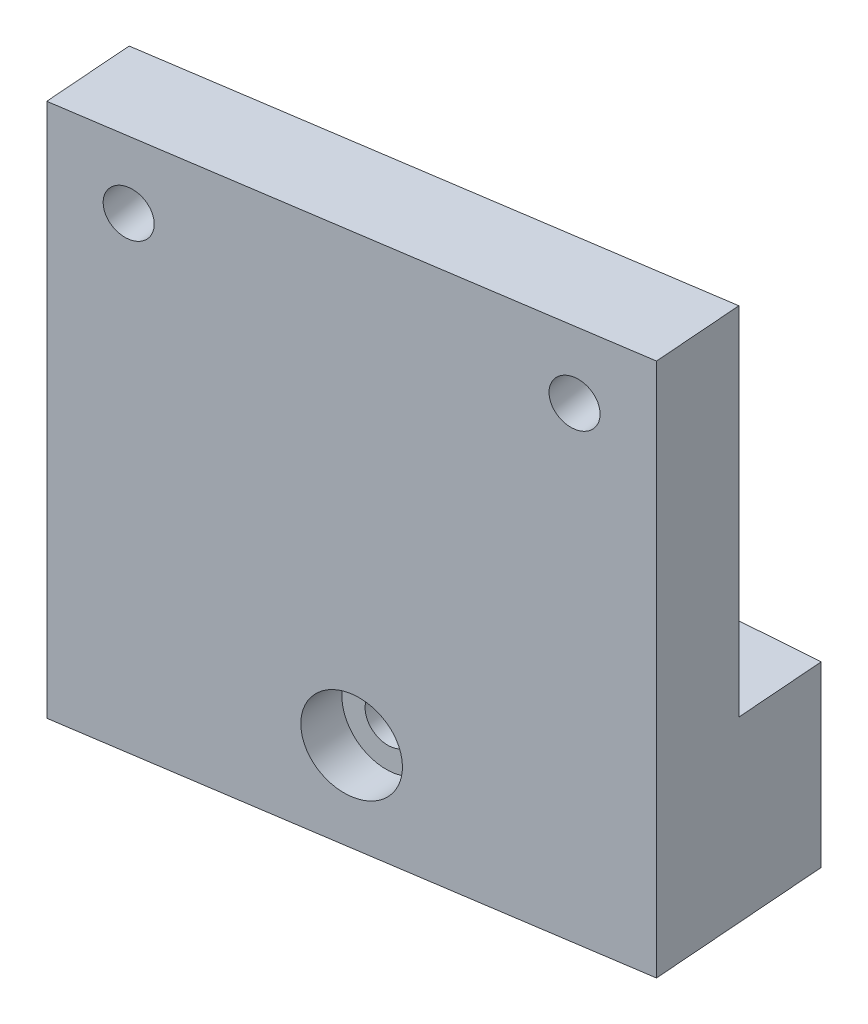
ISO-10303-21;
HEADER;
FILE_DESCRIPTION(('STEP AP214'),'2;1');
FILE_NAME('part.step','',(''),(''),'','','');
FILE_SCHEMA(('AUTOMOTIVE_DESIGN { 1 0 10303 214 1 1 1 1 }'));
ENDSEC;
DATA;
#1=APPLICATION_CONTEXT('core data for automotive mechanical design processes');
#2=APPLICATION_PROTOCOL_DEFINITION('international standard','automotive_design',2000,#1);
#3=PRODUCT_CONTEXT('',#1,'mechanical');
#4=PRODUCT('Part','Part','',(#3));
#5=PRODUCT_RELATED_PRODUCT_CATEGORY('part','',(#4));
#6=PRODUCT_DEFINITION_FORMATION('','',#4);
#7=PRODUCT_DEFINITION_CONTEXT('part definition',#1,'design');
#8=PRODUCT_DEFINITION('design','',#6,#7);
#9=PRODUCT_DEFINITION_SHAPE('','',#8);
#10=(LENGTH_UNIT() NAMED_UNIT(*) SI_UNIT(.MILLI.,.METRE.));
#11=(NAMED_UNIT(*) PLANE_ANGLE_UNIT() SI_UNIT($,.RADIAN.));
#12=(NAMED_UNIT(*) SI_UNIT($,.STERADIAN.) SOLID_ANGLE_UNIT());
#13=UNCERTAINTY_MEASURE_WITH_UNIT(LENGTH_MEASURE(1.E-05),#10,'distance_accuracy_value','');
#14=(GEOMETRIC_REPRESENTATION_CONTEXT(3) GLOBAL_UNCERTAINTY_ASSIGNED_CONTEXT((#13)) GLOBAL_UNIT_ASSIGNED_CONTEXT((#10,
#11,#12)) REPRESENTATION_CONTEXT('',''));
#15=CARTESIAN_POINT('',(0.,0.,0.));
#16=DIRECTION('',(0.,0.,1.));
#17=DIRECTION('',(1.,0.,0.));
#18=AXIS2_PLACEMENT_3D('',#15,#16,#17);
#19=CARTESIAN_POINT('',(201.637084779475,-2.09319908891186E-12,317.83234828125));
#20=DIRECTION('',(0.149160969546302,0.,0.988812927284027));
#21=DIRECTION('',(-0.988812927284027,0.,0.149160969546302));
#22=AXIS2_PLACEMENT_3D('',#19,#20,#21);
#23=PLANE('',#22);
#24=DIRECTION('',(0.988812927284027,0.,-0.149160969546302));
#25=VECTOR('',#24,1.);
#26=CARTESIAN_POINT('',(170.785083125901,-25.4000000000014,322.486327160482));
#27=LINE('',#26,#25);
#28=CARTESIAN_POINT('',(101.38564669068,-25.4,332.955129639711));
#29=VERTEX_POINT('',#28);
#30=CARTESIAN_POINT('',(176.944809549979,-25.4000000000016,321.557141527685));
#31=VERTEX_POINT('',#30);
#32=EDGE_CURVE('E111',#29,#31,#27,.T.);
#33=ORIENTED_EDGE('',*,*,#32,.T.);
#34=DIRECTION('',(0.,-1.,0.));
#35=VECTOR('',#34,1.);
#36=CARTESIAN_POINT('',(176.944809549979,-1.51692598349367E-12,321.557141527685));
#37=LINE('',#36,#35);
#38=CARTESIAN_POINT('',(176.94480954998,50.7999999999984,321.557141527685));
#39=VERTEX_POINT('',#38);
#40=EDGE_CURVE('E150',#39,#31,#37,.T.);
#41=ORIENTED_EDGE('',*,*,#40,.F.);
#42=DIRECTION('',(-0.988812927284027,0.,0.149160969546302));
#43=VECTOR('',#42,1.);
#44=CARTESIAN_POINT('',(101.385646690681,50.8,332.95512963971));
#45=LINE('',#44,#43);
#46=CARTESIAN_POINT('',(101.385646690681,50.8,332.95512963971));
#47=VERTEX_POINT('',#46);
#48=EDGE_CURVE('E171',#39,#47,#45,.T.);
#49=ORIENTED_EDGE('',*,*,#48,.T.);
#50=DIRECTION('',(0.,1.,0.));
#51=VECTOR('',#50,1.);
#52=CARTESIAN_POINT('',(101.38564669068,-7.223339336555E-13,332.955129639711));
#53=LINE('',#52,#51);
#54=EDGE_CURVE('E147',#29,#47,#53,.T.);
#55=ORIENTED_EDGE('',*,*,#54,.F.);
#56=EDGE_LOOP('',(#33,#41,#49,#55));
#57=FACE_BOUND('',#56,.T.);
#58=CARTESIAN_POINT('',(111.537794932015,41.2749999999998,331.423693072822));
#59=DIRECTION('',(-0.149160969546302,0.,-0.988812927284027));
#60=DIRECTION('',(-0.988812927284027,0.,0.149160969546302));
#61=AXIS2_PLACEMENT_3D('',#58,#59,#60);
#62=CIRCLE('',#61,3.1999999500002);
#63=CARTESIAN_POINT('',(108.373593614146,41.2749999999999,331.901008167912));
#64=VERTEX_POINT('',#63);
#65=EDGE_CURVE('E179',#64,#64,#62,.T.);
#66=ORIENTED_EDGE('',*,*,#65,.T.);
#67=EDGE_LOOP('',(#66));
#68=FACE_BOUND('',#67,.T.);
#69=CARTESIAN_POINT('',(166.792661308646,41.2749999999986,323.088578094574));
#70=DIRECTION('',(-0.149160969546302,0.,-0.988812927284027));
#71=DIRECTION('',(-0.988812927284027,0.,0.149160969546302));
#72=AXIS2_PLACEMENT_3D('',#69,#70,#71);
#73=CIRCLE('',#72,3.19999995000018);
#74=CARTESIAN_POINT('',(163.628459990778,41.2749999999987,323.565893189664));
#75=VERTEX_POINT('',#74);
#76=EDGE_CURVE('E123',#75,#75,#73,.T.);
#77=ORIENTED_EDGE('',*,*,#76,.T.);
#78=EDGE_LOOP('',(#77));
#79=FACE_BOUND('',#78,.T.);
#80=DIRECTION('',(0.,-1.,0.));
#81=VECTOR('',#80,1.);
#82=CARTESIAN_POINT('',(132.886266032077,-6.51266168130561E-13,328.203307740317));
#83=LINE('',#82,#81);
#84=CARTESIAN_POINT('',(132.886266032077,-12.2268346567056,328.203307740317));
#85=VERTEX_POINT('',#84);
#86=CARTESIAN_POINT('',(132.886266032077,-13.1766669993989,328.203307740317));
#87=VERTEX_POINT('',#86);
#88=EDGE_CURVE('E54',#85,#87,#83,.T.);
#89=ORIENTED_EDGE('',*,*,#88,.F.);
#90=CARTESIAN_POINT('',(139.165228120329,-12.7017508280524,327.256135583698));
#91=DIRECTION('',(-0.149160969546302,0.,-0.988812927284027));
#92=DIRECTION('',(-0.988812927284027,0.,0.149160969546302));
#93=AXIS2_PLACEMENT_3D('',#90,#91,#92);
#94=ELLIPSE('',#93,6.36783433064178,6.35);
#95=EDGE_CURVE('E12',#87,#85,#94,.F.);
#96=ORIENTED_EDGE('',*,*,#95,.F.);
#97=EDGE_LOOP('',(#89,#96));
#98=FACE_BOUND('',#97,.T.);
#99=ADVANCED_FACE('F45',(#57,#68,#79,#98),#23,.T.);
#100=CARTESIAN_POINT('',(183.174224896517,-1.58880373895447E-12,404.616012814854));
#101=DIRECTION('',(0.,-1.,0.));
#102=DIRECTION('',(-0.149160969546302,0.,-0.988812927284027));
#103=AXIS2_PLACEMENT_3D('',#100,#101,#102);
#104=PLANE('',#103);
#105=DIRECTION('',(0.988812927284027,0.,-0.149160969546302));
#106=VECTOR('',#105,1.);
#107=CARTESIAN_POINT('',(175.992309549979,-1.5781280467579E-12,308.857141527685));
#108=LINE('',#107,#106);
#109=CARTESIAN_POINT('',(100.43314669068,0.,320.255129639711));
#110=VERTEX_POINT('',#109);
#111=CARTESIAN_POINT('',(175.992309549979,-1.5781280467579E-12,308.857141527685));
#112=VERTEX_POINT('',#111);
#113=EDGE_CURVE('E120',#110,#112,#108,.T.);
#114=ORIENTED_EDGE('',*,*,#113,.T.);
#115=DIRECTION('',(-0.0747899482416343,0.,-0.997199309888456));
#116=VECTOR('',#115,1.);
#117=CARTESIAN_POINT('',(183.174224896517,-1.58853268489992E-12,404.616012814854));
#118=LINE('',#117,#116);
#119=CARTESIAN_POINT('',(175.039809549979,-1.58836636081722E-12,296.157141527685));
#120=VERTEX_POINT('',#119);
#121=EDGE_CURVE('E126',#112,#120,#118,.T.);
#122=ORIENTED_EDGE('',*,*,#121,.T.);
#123=DIRECTION('',(0.997199309888457,0.,-0.0747899482416342));
#124=VECTOR('',#123,1.);
#125=CARTESIAN_POINT('',(175.03980954998,-1.58863741487177E-12,296.157141527685));
#126=LINE('',#125,#124);
#127=CARTESIAN_POINT('',(99.0532221364789,0.,301.856135583698));
#128=VERTEX_POINT('',#127);
#129=EDGE_CURVE('E139',#128,#120,#126,.T.);
#130=ORIENTED_EDGE('',*,*,#129,.F.);
#131=DIRECTION('',(-0.0747899482416343,0.,-0.997199309888456));
#132=VECTOR('',#131,1.);
#133=CARTESIAN_POINT('',(107.187637483017,0.,410.315006870867));
#134=LINE('',#133,#132);
#135=EDGE_CURVE('E114',#110,#128,#134,.T.);
#136=ORIENTED_EDGE('',*,*,#135,.F.);
#137=EDGE_LOOP('',(#114,#122,#130,#136));
#138=FACE_BOUND('',#137,.T.);
#139=ADVANCED_FACE('F204',(#138),#104,.F.);
#140=CARTESIAN_POINT('',(145.180931189767,-12.7017508280524,407.465509842861));
#141=DIRECTION('',(-0.0747899482416343,0.,-0.997199309888456));
#142=DIRECTION('',(0.997199309888457,0.,-0.0747899482416342));
#143=AXIS2_PLACEMENT_3D('',#140,#141,#142);
#144=CYLINDRICAL_SURFACE('',#143,3.26390000000057);
#145=CARTESIAN_POINT('',(138.725830904868,-12.7017508280524,321.397506044216));
#146=DIRECTION('',(0.0747899482416342,0.,0.997199309888456));
#147=DIRECTION('',(0.997199309888456,0.,-0.0747899482416342));
#148=AXIS2_PLACEMENT_3D('',#145,#146,#147);
#149=CIRCLE('',#148,3.26390000000057);
#150=CARTESIAN_POINT('',(141.980589732414,-12.7017508280524,321.15339913215));
#151=VERTEX_POINT('',#150);
#152=EDGE_CURVE('E49',#151,#151,#149,.T.);
#153=CARTESIAN_POINT('',(137.046515843229,-12.7017508280524,299.006638555692));
#154=DIRECTION('',(-0.0747899482416343,0.,-0.997199309888456));
#155=DIRECTION('',(-0.997199309888456,0.,0.0747899482416342));
#156=AXIS2_PLACEMENT_3D('',#153,#154,#155);
#157=CIRCLE('',#156,3.26390000000057);
#158=CARTESIAN_POINT('',(140.301274670774,-12.7017508280524,298.762531643626));
#159=VERTEX_POINT('',#158);
#160=EDGE_CURVE('E144',#159,#159,#157,.T.);
#161=CARTESIAN_POINT('',(141.980589732414,-12.7017508280524,321.15339913215));
#162=CARTESIAN_POINT('',(141.963096867188,-12.7017508280524,320.920160929144));
#163=CARTESIAN_POINT('',(141.945604001963,-12.7017508280524,320.686922726139));
#164=CARTESIAN_POINT('',(141.910618271512,-12.7017508280524,320.220446320128));
#165=CARTESIAN_POINT('',(141.893125406287,-12.7017508280524,319.987208117123));
#166=CARTESIAN_POINT('',(141.858139675836,-12.7017508280524,319.520731711112));
#167=CARTESIAN_POINT('',(141.84064681061,-12.7017508280524,319.287493508106));
#168=CARTESIAN_POINT('',(141.80566108016,-12.7017508280524,318.821017102095));
#169=CARTESIAN_POINT('',(141.788168214934,-12.7017508280524,318.58777889909));
#170=CARTESIAN_POINT('',(141.753182484483,-12.7017508280524,318.121302493079));
#171=CARTESIAN_POINT('',(141.735689619258,-12.7017508280524,317.888064290073));
#172=CARTESIAN_POINT('',(141.700703888807,-12.7017508280524,317.421587884062));
#173=CARTESIAN_POINT('',(141.683211023582,-12.7017508280524,317.188349681057));
#174=CARTESIAN_POINT('',(141.648225293131,-12.7017508280524,316.721873275046));
#175=CARTESIAN_POINT('',(141.630732427905,-12.7017508280524,316.488635072041));
#176=CARTESIAN_POINT('',(141.595746697455,-12.7017508280524,316.02215866603));
#177=CARTESIAN_POINT('',(141.578253832229,-12.7017508280524,315.788920463024));
#178=CARTESIAN_POINT('',(141.543268101778,-12.7017508280524,315.322444057013));
#179=CARTESIAN_POINT('',(141.525775236553,-12.7017508280524,315.089205854008));
#180=CARTESIAN_POINT('',(141.490789506102,-12.7017508280524,314.622729447997));
#181=CARTESIAN_POINT('',(141.473296640877,-12.7017508280524,314.389491244992));
#182=CARTESIAN_POINT('',(141.438310910426,-12.7017508280524,313.923014838981));
#183=CARTESIAN_POINT('',(141.420818045201,-12.7017508280524,313.689776635975));
#184=CARTESIAN_POINT('',(141.38583231475,-12.7017508280524,313.223300229964));
#185=CARTESIAN_POINT('',(141.368339449524,-12.7017508280524,312.990062026959));
#186=CARTESIAN_POINT('',(141.333353719074,-12.7017508280524,312.523585620948));
#187=CARTESIAN_POINT('',(141.315860853848,-12.7017508280524,312.290347417942));
#188=CARTESIAN_POINT('',(141.280875123397,-12.7017508280524,311.823871011931));
#189=CARTESIAN_POINT('',(141.263382258172,-12.7017508280524,311.590632808926));
#190=CARTESIAN_POINT('',(141.228396527721,-12.7017508280524,311.124156402915));
#191=CARTESIAN_POINT('',(141.210903662496,-12.7017508280524,310.89091819991));
#192=CARTESIAN_POINT('',(141.175917932045,-12.7017508280524,310.424441793899));
#193=CARTESIAN_POINT('',(141.158425066819,-12.7017508280524,310.191203590893));
#194=CARTESIAN_POINT('',(141.123439336369,-12.7017508280524,309.724727184882));
#195=CARTESIAN_POINT('',(141.105946471143,-12.7017508280524,309.491488981877));
#196=CARTESIAN_POINT('',(141.070960740692,-12.7017508280524,309.025012575866));
#197=CARTESIAN_POINT('',(141.053467875467,-12.7017508280524,308.791774372861));
#198=CARTESIAN_POINT('',(141.018482145016,-12.7017508280524,308.32529796685));
#199=CARTESIAN_POINT('',(141.000989279791,-12.7017508280524,308.092059763844));
#200=CARTESIAN_POINT('',(140.96600354934,-12.7017508280524,307.625583357833));
#201=CARTESIAN_POINT('',(140.948510684115,-12.7017508280524,307.392345154828));
#202=CARTESIAN_POINT('',(140.913524953664,-12.7017508280524,306.925868748817));
#203=CARTESIAN_POINT('',(140.896032088438,-12.7017508280524,306.692630545811));
#204=CARTESIAN_POINT('',(140.861046357988,-12.7017508280524,306.2261541398));
#205=CARTESIAN_POINT('',(140.843553492762,-12.7017508280524,305.992915936795));
#206=CARTESIAN_POINT('',(140.808567762311,-12.7017508280524,305.526439530784));
#207=CARTESIAN_POINT('',(140.791074897086,-12.7017508280524,305.293201327779));
#208=CARTESIAN_POINT('',(140.756089166635,-12.7017508280524,304.826724921768));
#209=CARTESIAN_POINT('',(140.73859630141,-12.7017508280524,304.593486718762));
#210=CARTESIAN_POINT('',(140.703610570959,-12.7017508280524,304.127010312751));
#211=CARTESIAN_POINT('',(140.686117705733,-12.7017508280524,303.893772109746));
#212=CARTESIAN_POINT('',(140.651131975283,-12.7017508280524,303.427295703735));
#213=CARTESIAN_POINT('',(140.633639110057,-12.7017508280524,303.194057500729));
#214=CARTESIAN_POINT('',(140.598653379606,-12.7017508280524,302.727581094719));
#215=CARTESIAN_POINT('',(140.581160514381,-12.7017508280524,302.494342891713));
#216=CARTESIAN_POINT('',(140.54617478393,-12.7017508280524,302.027866485702));
#217=CARTESIAN_POINT('',(140.528681918705,-12.7017508280524,301.794628282697));
#218=CARTESIAN_POINT('',(140.493696188254,-12.7017508280524,301.328151876686));
#219=CARTESIAN_POINT('',(140.476203323028,-12.7017508280524,301.09491367368));
#220=CARTESIAN_POINT('',(140.441217592578,-12.7017508280524,300.628437267669));
#221=CARTESIAN_POINT('',(140.423724727352,-12.7017508280524,300.395199064664));
#222=CARTESIAN_POINT('',(140.388738996901,-12.7017508280524,299.928722658653));
#223=CARTESIAN_POINT('',(140.371246131676,-12.7017508280524,299.695484455648));
#224=CARTESIAN_POINT('',(140.336260401225,-12.7017508280524,299.229008049637));
#225=CARTESIAN_POINT('',(140.318767536,-12.7017508280524,298.995769846631));
#226=CARTESIAN_POINT('',(140.301274670774,-12.7017508280524,298.762531643626));
#227=B_SPLINE_CURVE_WITH_KNOTS('',3,(#161,#162,#163,#164,#165,#166,#167,#168,#169,#170,#171,
#172,#173,#174,#175,#176,#177,#178,#179,#180,#181,#182,#183,#184,#185,#186,#187,#188,#189,#190,
#191,#192,#193,#194,#195,#196,#197,#198,#199,#200,#201,#202,#203,#204,#205,#206,#207,#208,#209,
#210,#211,#212,#213,#214,#215,#216,#217,#218,#219,#220,#221,#222,#223,#224,#225,#226),
.UNSPECIFIED.,.F.,.F.,(4,2,2,2,2,2,2,2,2,2,2,2,2,2,2,2,2,2,2,2,2,2,2,2,2,2,2,2,2,2,2,2,4),(0.,
0.701679796684399,1.40335959336885,2.10503939005325,2.80671918673765,3.50839898342211,
4.21007878010656,4.91175857679096,5.61343837347536,6.31511817015982,7.01679796684421,
7.71847776352861,8.42015756021307,9.12183735689752,9.82351715358192,10.5251969502663,
11.2268767469508,11.9285565436352,12.6302363403196,13.331916137004,14.0335959336885,
14.7352757303729,15.4369555270573,16.1386353237417,16.8403151204261,17.5419949171106,
18.243674713795,18.9453545104794,19.6470343071638,20.3487141038482,21.0503939005327,
21.7520736972171,22.4537534939016),.UNSPECIFIED.);
#228=EDGE_CURVE('BSEAM47',#151,#159,#227,.T.);
#229=ORIENTED_EDGE('',*,*,#152,.T.);
#230=ORIENTED_EDGE('',*,*,#160,.T.);
#231=ORIENTED_EDGE('',*,*,#228,.T.);
#232=ORIENTED_EDGE('',*,*,#228,.F.);
#233=EDGE_LOOP('',(#229,#231,#230,#232));
#234=FACE_BOUND('',#233,.T.);
#235=ADVANCED_FACE('F47',(#234),#144,.F.);
#236=CARTESIAN_POINT('',(175.03980954998,-1.57121667002262E-12,296.157141527685));
#237=DIRECTION('',(0.0747899482416343,0.,0.997199309888456));
#238=DIRECTION('',(-0.997199309888456,0.,0.0747899482416342));
#239=AXIS2_PLACEMENT_3D('',#236,#237,#238);
#240=PLANE('',#239);
#241=CARTESIAN_POINT('',(156.043162696604,-12.7017508280528,297.581890041689));
#242=DIRECTION('',(-0.0747899482416343,0.,-0.997199309888456));
#243=DIRECTION('',(-0.997199309888456,0.,0.0747899482416342));
#244=AXIS2_PLACEMENT_3D('',#241,#242,#243);
#245=CIRCLE('',#244,2.3622000000004);
#246=CARTESIAN_POINT('',(153.687578486785,-12.7017508280527,297.758558857425));
#247=VERTEX_POINT('',#246);
#248=EDGE_CURVE('E160',#247,#247,#245,.T.);
#249=ORIENTED_EDGE('',*,*,#248,.F.);
#250=EDGE_LOOP('',(#249));
#251=FACE_BOUND('',#250,.T.);
#252=CARTESIAN_POINT('',(118.049868989854,-12.701750828052,300.431387069695));
#253=DIRECTION('',(-0.0747899482416343,0.,-0.997199309888456));
#254=DIRECTION('',(-0.997199309888456,0.,0.0747899482416342));
#255=AXIS2_PLACEMENT_3D('',#252,#253,#254);
#256=CIRCLE('',#255,2.36220000000041);
#257=CARTESIAN_POINT('',(115.694284780035,-12.7017508280519,300.608055885431));
#258=VERTEX_POINT('',#257);
#259=EDGE_CURVE('E154',#258,#258,#256,.T.);
#260=ORIENTED_EDGE('',*,*,#259,.F.);
#261=EDGE_LOOP('',(#260));
#262=FACE_BOUND('',#261,.T.);
#263=ORIENTED_EDGE('',*,*,#160,.F.);
#264=EDGE_LOOP('',(#263));
#265=FACE_BOUND('',#264,.T.);
#266=DIRECTION('',(0.,1.,0.));
#267=VECTOR('',#266,1.);
#268=CARTESIAN_POINT('',(99.0532221364789,-7.82398205812949E-13,301.856135583698));
#269=LINE('',#268,#267);
#270=CARTESIAN_POINT('',(99.0532221364787,-25.4,301.856135583698));
#271=VERTEX_POINT('',#270);
#272=EDGE_CURVE('E142',#271,#128,#269,.T.);
#273=ORIENTED_EDGE('',*,*,#272,.T.);
#274=ORIENTED_EDGE('',*,*,#129,.T.);
#275=DIRECTION('',(0.,-1.,0.));
#276=VECTOR('',#275,1.);
#277=CARTESIAN_POINT('',(175.039809549979,-1.57121667002262E-12,296.157141527685));
#278=LINE('',#277,#276);
#279=CARTESIAN_POINT('',(175.039809549979,-25.4000000000016,296.157141527685));
#280=VERTEX_POINT('',#279);
#281=EDGE_CURVE('E136',#120,#280,#278,.T.);
#282=ORIENTED_EDGE('',*,*,#281,.T.);
#283=DIRECTION('',(0.997199309888456,0.,-0.0747899482416342));
#284=VECTOR('',#283,1.);
#285=CARTESIAN_POINT('',(175.039809549979,-25.4000000000016,296.157141527685));
#286=LINE('',#285,#284);
#287=EDGE_CURVE('E133',#271,#280,#286,.T.);
#288=ORIENTED_EDGE('',*,*,#287,.F.);
#289=EDGE_LOOP('',(#273,#274,#282,#288));
#290=FACE_BOUND('',#289,.T.);
#291=ADVANCED_FACE('F217',(#251,#262,#265,#290),#240,.F.);
#292=CARTESIAN_POINT('',(183.174224896517,-25.4000000000016,404.616012814854));
#293=DIRECTION('',(0.,-1.,0.));
#294=DIRECTION('',(-0.988812927284027,0.,0.149160969546302));
#295=AXIS2_PLACEMENT_3D('',#292,#293,#294);
#296=PLANE('',#295);
#297=DIRECTION('',(-0.0747899482416343,0.,-0.997199309888456));
#298=VECTOR('',#297,1.);
#299=CARTESIAN_POINT('',(107.187637483016,-25.4,410.315006870867));
#300=LINE('',#299,#298);
#301=EDGE_CURVE('E131',#29,#271,#300,.T.);
#302=ORIENTED_EDGE('',*,*,#301,.T.);
#303=ORIENTED_EDGE('',*,*,#287,.T.);
#304=DIRECTION('',(-0.0747899482416343,0.,-0.997199309888456));
#305=VECTOR('',#304,1.);
#306=CARTESIAN_POINT('',(183.174224896517,-25.4000000000016,404.616012814854));
#307=LINE('',#306,#305);
#308=EDGE_CURVE('E129',#31,#280,#307,.T.);
#309=ORIENTED_EDGE('',*,*,#308,.F.);
#310=ORIENTED_EDGE('',*,*,#32,.F.);
#311=EDGE_LOOP('',(#302,#303,#309,#310));
#312=FACE_BOUND('',#311,.T.);
#313=ADVANCED_FACE('F220',(#312),#296,.T.);
#314=CARTESIAN_POINT('',(183.174224896517,-1.57138299410532E-12,404.616012814854));
#315=DIRECTION('',(-0.997199309888456,0.,0.0747899482416342));
#316=DIRECTION('',(-0.0747899482416343,0.,-0.997199309888457));
#317=AXIS2_PLACEMENT_3D('',#314,#315,#316);
#318=PLANE('',#317);
#319=ORIENTED_EDGE('',*,*,#40,.T.);
#320=ORIENTED_EDGE('',*,*,#308,.T.);
#321=ORIENTED_EDGE('',*,*,#281,.F.);
#322=ORIENTED_EDGE('',*,*,#121,.F.);
#323=DIRECTION('',(0.,-1.,0.));
#324=VECTOR('',#323,1.);
#325=CARTESIAN_POINT('',(175.99230954998,50.7999999999984,308.857141527685));
#326=LINE('',#325,#324);
#327=CARTESIAN_POINT('',(175.99230954998,50.7999999999984,308.857141527685));
#328=VERTEX_POINT('',#327);
#329=EDGE_CURVE('E166',#328,#112,#326,.T.);
#330=ORIENTED_EDGE('',*,*,#329,.F.);
#331=DIRECTION('',(0.0747899482416343,0.,0.997199309888456));
#332=VECTOR('',#331,1.);
#333=CARTESIAN_POINT('',(176.94480954998,50.7999999999984,321.557141527685));
#334=LINE('',#333,#332);
#335=EDGE_CURVE('E168',#328,#39,#334,.T.);
#336=ORIENTED_EDGE('',*,*,#335,.T.);
#337=EDGE_LOOP('',(#319,#320,#321,#322,#330,#336));
#338=FACE_BOUND('',#337,.T.);
#339=ADVANCED_FACE('F224',(#338),#318,.F.);
#340=CARTESIAN_POINT('',(107.187637483017,-7.82564529895654E-13,410.315006870867));
#341=DIRECTION('',(0.997199309888456,0.,-0.0747899482416342));
#342=DIRECTION('',(0.0747899482416343,0.,0.997199309888457));
#343=AXIS2_PLACEMENT_3D('',#340,#341,#342);
#344=PLANE('',#343);
#345=ORIENTED_EDGE('',*,*,#54,.T.);
#346=DIRECTION('',(-0.0747899482416346,0.,-0.997199309888456));
#347=VECTOR('',#346,1.);
#348=CARTESIAN_POINT('',(100.433146690681,50.8,320.255129639711));
#349=LINE('',#348,#347);
#350=CARTESIAN_POINT('',(100.433146690681,50.8,320.255129639711));
#351=VERTEX_POINT('',#350);
#352=EDGE_CURVE('E175',#47,#351,#349,.T.);
#353=ORIENTED_EDGE('',*,*,#352,.T.);
#354=DIRECTION('',(0.,-1.,0.));
#355=VECTOR('',#354,1.);
#356=CARTESIAN_POINT('',(100.433146690681,50.8,320.255129639711));
#357=LINE('',#356,#355);
#358=EDGE_CURVE('E67',#351,#110,#357,.T.);
#359=ORIENTED_EDGE('',*,*,#358,.T.);
#360=ORIENTED_EDGE('',*,*,#135,.T.);
#361=ORIENTED_EDGE('',*,*,#272,.F.);
#362=ORIENTED_EDGE('',*,*,#301,.F.);
#363=EDGE_LOOP('',(#345,#353,#359,#360,#361,#362));
#364=FACE_BOUND('',#363,.T.);
#365=ADVANCED_FACE('F227',(#364),#344,.F.);
#366=CARTESIAN_POINT('',(117.574952818519,-12.701750828052,294.099171451903));
#367=DIRECTION('',(0.0747899482416343,0.,0.997199309888456));
#368=DIRECTION('',(-0.997199309888457,0.,0.0747899482416342));
#369=AXIS2_PLACEMENT_3D('',#366,#367,#368);
#370=CYLINDRICAL_SURFACE('',#369,2.36220000000041);
#371=CARTESIAN_POINT('',(117.574952818519,-12.701750828052,294.099171451903));
#372=DIRECTION('',(-0.0747899482416343,0.,-0.997199309888456));
#373=DIRECTION('',(-0.997199309888456,0.,0.0747899482416342));
#374=AXIS2_PLACEMENT_3D('',#371,#372,#373);
#375=CIRCLE('',#374,2.36220000000041);
#376=CARTESIAN_POINT('',(115.2193686087,-12.7017508280519,294.27584026764));
#377=VERTEX_POINT('',#376);
#378=EDGE_CURVE('E157',#377,#377,#375,.T.);
#379=CARTESIAN_POINT('',(115.2193686087,-12.7017508280519,294.27584026764));
#380=CARTESIAN_POINT('',(115.224315652152,-12.7017508280519,294.341800846992));
#381=CARTESIAN_POINT('',(115.229262695603,-12.7017508280519,294.407761426344));
#382=CARTESIAN_POINT('',(115.239156782506,-12.7017508280519,294.539682585048));
#383=CARTESIAN_POINT('',(115.244103825957,-12.7017508280519,294.6056431644));
#384=CARTESIAN_POINT('',(115.25399791286,-12.7017508280519,294.737564323104));
#385=CARTESIAN_POINT('',(115.258944956312,-12.7017508280519,294.803524902456));
#386=CARTESIAN_POINT('',(115.268839043214,-12.7017508280519,294.935446061159));
#387=CARTESIAN_POINT('',(115.273786086666,-12.7017508280519,295.001406640512));
#388=CARTESIAN_POINT('',(115.283680173569,-12.7017508280519,295.133327799216));
#389=CARTESIAN_POINT('',(115.28862721702,-12.7017508280519,295.199288378568));
#390=CARTESIAN_POINT('',(115.298521303923,-12.7017508280519,295.331209537271));
#391=CARTESIAN_POINT('',(115.303468347374,-12.7017508280519,295.397170116624));
#392=CARTESIAN_POINT('',(115.313362434277,-12.7017508280519,295.529091275328));
#393=CARTESIAN_POINT('',(115.318309477728,-12.7017508280519,295.595051854679));
#394=CARTESIAN_POINT('',(115.328203564631,-12.7017508280519,295.726973013383));
#395=CARTESIAN_POINT('',(115.333150608083,-12.7017508280519,295.792933592735));
#396=CARTESIAN_POINT('',(115.343044694985,-12.7017508280519,295.924854751439));
#397=CARTESIAN_POINT('',(115.347991738437,-12.7017508280519,295.990815330791));
#398=CARTESIAN_POINT('',(115.35788582534,-12.7017508280519,296.122736489495));
#399=CARTESIAN_POINT('',(115.362832868791,-12.7017508280519,296.188697068847));
#400=CARTESIAN_POINT('',(115.372726955694,-12.7017508280519,296.320618227551));
#401=CARTESIAN_POINT('',(115.377673999145,-12.7017508280519,296.386578806903));
#402=CARTESIAN_POINT('',(115.387568086048,-12.7017508280519,296.518499965607));
#403=CARTESIAN_POINT('',(115.392515129499,-12.7017508280519,296.584460544959));
#404=CARTESIAN_POINT('',(115.402409216402,-12.7017508280519,296.716381703663));
#405=CARTESIAN_POINT('',(115.407356259854,-12.7017508280519,296.782342283015));
#406=CARTESIAN_POINT('',(115.417250346756,-12.7017508280519,296.914263441719));
#407=CARTESIAN_POINT('',(115.422197390208,-12.7017508280519,296.980224021071));
#408=CARTESIAN_POINT('',(115.432091477111,-12.7017508280519,297.112145179775));
#409=CARTESIAN_POINT('',(115.437038520562,-12.7017508280519,297.178105759127));
#410=CARTESIAN_POINT('',(115.446932607465,-12.7017508280519,297.310026917831));
#411=CARTESIAN_POINT('',(115.451879650916,-12.7017508280519,297.375987497183));
#412=CARTESIAN_POINT('',(115.461773737819,-12.7017508280519,297.507908655887));
#413=CARTESIAN_POINT('',(115.46672078127,-12.7017508280519,297.573869235239));
#414=CARTESIAN_POINT('',(115.476614868173,-12.7017508280519,297.705790393943));
#415=CARTESIAN_POINT('',(115.481561911625,-12.7017508280519,297.771750973295));
#416=CARTESIAN_POINT('',(115.491455998527,-12.7017508280519,297.903672131999));
#417=CARTESIAN_POINT('',(115.496403041979,-12.7017508280519,297.969632711351));
#418=CARTESIAN_POINT('',(115.506297128882,-12.7017508280519,298.101553870055));
#419=CARTESIAN_POINT('',(115.511244172333,-12.7017508280519,298.167514449407));
#420=CARTESIAN_POINT('',(115.521138259236,-12.7017508280519,298.299435608111));
#421=CARTESIAN_POINT('',(115.526085302687,-12.7017508280519,298.365396187463));
#422=CARTESIAN_POINT('',(115.53597938959,-12.7017508280519,298.497317346167));
#423=CARTESIAN_POINT('',(115.540926433041,-12.7017508280519,298.563277925519));
#424=CARTESIAN_POINT('',(115.550820519944,-12.7017508280519,298.695199084223));
#425=CARTESIAN_POINT('',(115.555767563396,-12.7017508280519,298.761159663575));
#426=CARTESIAN_POINT('',(115.565661650298,-12.7017508280519,298.893080822279));
#427=CARTESIAN_POINT('',(115.57060869375,-12.7017508280519,298.959041401631));
#428=CARTESIAN_POINT('',(115.580502780653,-12.7017508280519,299.090962560335));
#429=CARTESIAN_POINT('',(115.585449824104,-12.7017508280519,299.156923139687));
#430=CARTESIAN_POINT('',(115.595343911007,-12.7017508280519,299.288844298391));
#431=CARTESIAN_POINT('',(115.600290954458,-12.7017508280519,299.354804877743));
#432=CARTESIAN_POINT('',(115.610185041361,-12.7017508280519,299.486726036447));
#433=CARTESIAN_POINT('',(115.615132084812,-12.7017508280519,299.552686615799));
#434=CARTESIAN_POINT('',(115.625026171715,-12.7017508280519,299.684607774503));
#435=CARTESIAN_POINT('',(115.629973215167,-12.7017508280519,299.750568353855));
#436=CARTESIAN_POINT('',(115.639867302069,-12.7017508280519,299.882489512559));
#437=CARTESIAN_POINT('',(115.644814345521,-12.7017508280519,299.948450091911));
#438=CARTESIAN_POINT('',(115.654708432424,-12.7017508280519,300.080371250615));
#439=CARTESIAN_POINT('',(115.659655475875,-12.7017508280519,300.146331829967));
#440=CARTESIAN_POINT('',(115.669549562778,-12.7017508280519,300.278252988671));
#441=CARTESIAN_POINT('',(115.674496606229,-12.7017508280519,300.344213568023));
#442=CARTESIAN_POINT('',(115.684390693132,-12.7017508280519,300.476134726727));
#443=CARTESIAN_POINT('',(115.689337736583,-12.7017508280519,300.542095306079));
#444=CARTESIAN_POINT('',(115.694284780035,-12.7017508280519,300.608055885431));
#445=B_SPLINE_CURVE_WITH_KNOTS('',3,(#379,#380,#381,#382,#383,#384,#385,#386,#387,#388,#389,
#390,#391,#392,#393,#394,#395,#396,#397,#398,#399,#400,#401,#402,#403,#404,#405,#406,#407,#408,
#409,#410,#411,#412,#413,#414,#415,#416,#417,#418,#419,#420,#421,#422,#423,#424,#425,#426,#427,
#428,#429,#430,#431,#432,#433,#434,#435,#436,#437,#438,#439,#440,#441,#442,#443,#444),
.UNSPECIFIED.,.F.,.F.,(4,2,2,2,2,2,2,2,2,2,2,2,2,2,2,2,2,2,2,2,2,2,2,2,2,2,2,2,2,2,2,2,4),(0.,
0.19843749999997,0.396874999999996,0.595312499999966,0.793749999999992,0.992187499999961,
1.19062499999999,1.38906249999996,1.58749999999998,1.78593749999995,1.98437499999998,
2.18281249999995,2.38124999999997,2.57968749999994,2.77812499999997,2.97656249999994,
3.17499999999996,3.37343749999999,3.57187499999996,3.77031249999998,3.96874999999996,
4.16718749999998,4.36562499999995,4.56406249999998,4.76249999999995,4.96093749999997,
5.15937499999994,5.35781249999997,5.55624999999994,5.75468749999996,5.95312499999993,
6.15156249999996,6.34999999999993),.UNSPECIFIED.);
#446=EDGE_CURVE('BSEAM215',#377,#258,#445,.T.);
#447=ORIENTED_EDGE('',*,*,#378,.F.);
#448=ORIENTED_EDGE('',*,*,#259,.T.);
#449=ORIENTED_EDGE('',*,*,#446,.T.);
#450=ORIENTED_EDGE('',*,*,#446,.F.);
#451=EDGE_LOOP('',(#447,#449,#448,#450));
#452=FACE_BOUND('',#451,.T.);
#453=ADVANCED_FACE('F215',(#452),#370,.T.);
#454=CARTESIAN_POINT('',(174.564893378645,-1.57120695942964E-12,289.824925909894));
#455=DIRECTION('',(0.0747899482416343,0.,0.997199309888456));
#456=DIRECTION('',(-0.997199309888456,0.,0.0747899482416342));
#457=AXIS2_PLACEMENT_3D('',#454,#455,#456);
#458=PLANE('',#457);
#459=ORIENTED_EDGE('',*,*,#378,.T.);
#460=EDGE_LOOP('',(#459));
#461=FACE_BOUND('',#460,.T.);
#462=ADVANCED_FACE('F233',(#461),#458,.F.);
#463=CARTESIAN_POINT('',(155.56824652527,-12.7017508280528,291.249674423897));
#464=DIRECTION('',(0.0747899482416343,0.,0.997199309888456));
#465=DIRECTION('',(-0.997199309888457,0.,0.0747899482416342));
#466=AXIS2_PLACEMENT_3D('',#463,#464,#465);
#467=CYLINDRICAL_SURFACE('',#466,2.3622000000004);
#468=CARTESIAN_POINT('',(155.56824652527,-12.7017508280528,291.249674423897));
#469=DIRECTION('',(-0.0747899482416343,0.,-0.997199309888456));
#470=DIRECTION('',(-0.997199309888456,0.,0.0747899482416342));
#471=AXIS2_PLACEMENT_3D('',#468,#469,#470);
#472=CIRCLE('',#471,2.3622000000004);
#473=CARTESIAN_POINT('',(153.212662315451,-12.7017508280527,291.426343239633));
#474=VERTEX_POINT('',#473);
#475=EDGE_CURVE('E153',#474,#474,#472,.T.);
#476=CARTESIAN_POINT('',(153.212662315451,-12.7017508280527,291.426343239633));
#477=CARTESIAN_POINT('',(153.217609358902,-12.7017508280527,291.492303818985));
#478=CARTESIAN_POINT('',(153.222556402354,-12.7017508280527,291.558264398337));
#479=CARTESIAN_POINT('',(153.232450489256,-12.7017508280527,291.690185557041));
#480=CARTESIAN_POINT('',(153.237397532708,-12.7017508280527,291.756146136393));
#481=CARTESIAN_POINT('',(153.24729161961,-12.7017508280527,291.888067295097));
#482=CARTESIAN_POINT('',(153.252238663062,-12.7017508280527,291.954027874449));
#483=CARTESIAN_POINT('',(153.262132749965,-12.7017508280527,292.085949033153));
#484=CARTESIAN_POINT('',(153.267079793416,-12.7017508280527,292.151909612505));
#485=CARTESIAN_POINT('',(153.276973880319,-12.7017508280527,292.283830771209));
#486=CARTESIAN_POINT('',(153.28192092377,-12.7017508280527,292.349791350561));
#487=CARTESIAN_POINT('',(153.291815010673,-12.7017508280527,292.481712509265));
#488=CARTESIAN_POINT('',(153.296762054124,-12.7017508280527,292.547673088617));
#489=CARTESIAN_POINT('',(153.306656141027,-12.7017508280527,292.679594247321));
#490=CARTESIAN_POINT('',(153.311603184479,-12.7017508280527,292.745554826673));
#491=CARTESIAN_POINT('',(153.321497271382,-12.7017508280527,292.877475985377));
#492=CARTESIAN_POINT('',(153.326444314833,-12.7017508280527,292.943436564729));
#493=CARTESIAN_POINT('',(153.336338401736,-12.7017508280527,293.075357723433));
#494=CARTESIAN_POINT('',(153.341285445187,-12.7017508280527,293.141318302785));
#495=CARTESIAN_POINT('',(153.35117953209,-12.7017508280527,293.273239461489));
#496=CARTESIAN_POINT('',(153.356126575541,-12.7017508280527,293.339200040841));
#497=CARTESIAN_POINT('',(153.366020662444,-12.7017508280527,293.471121199545));
#498=CARTESIAN_POINT('',(153.370967705896,-12.7017508280527,293.537081778897));
#499=CARTESIAN_POINT('',(153.380861792798,-12.7017508280527,293.669002937601));
#500=CARTESIAN_POINT('',(153.38580883625,-12.7017508280527,293.734963516953));
#501=CARTESIAN_POINT('',(153.395702923152,-12.7017508280527,293.866884675657));
#502=CARTESIAN_POINT('',(153.400649966604,-12.7017508280527,293.932845255009));
#503=CARTESIAN_POINT('',(153.410544053507,-12.7017508280527,294.064766413713));
#504=CARTESIAN_POINT('',(153.415491096958,-12.7017508280527,294.130726993065));
#505=CARTESIAN_POINT('',(153.425385183861,-12.7017508280527,294.262648151769));
#506=CARTESIAN_POINT('',(153.430332227312,-12.7017508280527,294.328608731121));
#507=CARTESIAN_POINT('',(153.440226314215,-12.7017508280527,294.460529889825));
#508=CARTESIAN_POINT('',(153.445173357667,-12.7017508280527,294.526490469177));
#509=CARTESIAN_POINT('',(153.455067444569,-12.7017508280527,294.658411627881));
#510=CARTESIAN_POINT('',(153.460014488021,-12.7017508280527,294.724372207233));
#511=CARTESIAN_POINT('',(153.469908574923,-12.7017508280527,294.856293365937));
#512=CARTESIAN_POINT('',(153.474855618375,-12.7017508280527,294.922253945289));
#513=CARTESIAN_POINT('',(153.484749705278,-12.7017508280527,295.054175103993));
#514=CARTESIAN_POINT('',(153.489696748729,-12.7017508280527,295.120135683345));
#515=CARTESIAN_POINT('',(153.499590835632,-12.7017508280527,295.252056842049));
#516=CARTESIAN_POINT('',(153.504537879083,-12.7017508280527,295.318017421401));
#517=CARTESIAN_POINT('',(153.514431965986,-12.7017508280527,295.449938580105));
#518=CARTESIAN_POINT('',(153.519379009437,-12.7017508280527,295.515899159457));
#519=CARTESIAN_POINT('',(153.52927309634,-12.7017508280527,295.647820318161));
#520=CARTESIAN_POINT('',(153.534220139792,-12.7017508280527,295.713780897513));
#521=CARTESIAN_POINT('',(153.544114226695,-12.7017508280527,295.845702056217));
#522=CARTESIAN_POINT('',(153.549061270146,-12.7017508280527,295.911662635569));
#523=CARTESIAN_POINT('',(153.558955357049,-12.7017508280527,296.043583794273));
#524=CARTESIAN_POINT('',(153.5639024005,-12.7017508280527,296.109544373625));
#525=CARTESIAN_POINT('',(153.573796487403,-12.7017508280527,296.241465532329));
#526=CARTESIAN_POINT('',(153.578743530854,-12.7017508280527,296.307426111681));
#527=CARTESIAN_POINT('',(153.588637617757,-12.7017508280527,296.439347270385));
#528=CARTESIAN_POINT('',(153.593584661208,-12.7017508280527,296.505307849737));
#529=CARTESIAN_POINT('',(153.603478748111,-12.7017508280527,296.637229008441));
#530=CARTESIAN_POINT('',(153.608425791563,-12.7017508280527,296.703189587793));
#531=CARTESIAN_POINT('',(153.618319878465,-12.7017508280527,296.835110746497));
#532=CARTESIAN_POINT('',(153.623266921917,-12.7017508280527,296.901071325849));
#533=CARTESIAN_POINT('',(153.63316100882,-12.7017508280527,297.032992484553));
#534=CARTESIAN_POINT('',(153.638108052271,-12.7017508280527,297.098953063905));
#535=CARTESIAN_POINT('',(153.648002139174,-12.7017508280527,297.230874222609));
#536=CARTESIAN_POINT('',(153.652949182625,-12.7017508280527,297.296834801961));
#537=CARTESIAN_POINT('',(153.662843269528,-12.7017508280527,297.428755960665));
#538=CARTESIAN_POINT('',(153.667790312979,-12.7017508280527,297.494716540017));
#539=CARTESIAN_POINT('',(153.677684399882,-12.7017508280527,297.626637698721));
#540=CARTESIAN_POINT('',(153.682631443334,-12.7017508280527,297.692598278073));
#541=CARTESIAN_POINT('',(153.687578486785,-12.7017508280527,297.758558857425));
#542=B_SPLINE_CURVE_WITH_KNOTS('',3,(#476,#477,#478,#479,#480,#481,#482,#483,#484,#485,#486,
#487,#488,#489,#490,#491,#492,#493,#494,#495,#496,#497,#498,#499,#500,#501,#502,#503,#504,#505,
#506,#507,#508,#509,#510,#511,#512,#513,#514,#515,#516,#517,#518,#519,#520,#521,#522,#523,#524,
#525,#526,#527,#528,#529,#530,#531,#532,#533,#534,#535,#536,#537,#538,#539,#540,#541),
.UNSPECIFIED.,.F.,.F.,(4,2,2,2,2,2,2,2,2,2,2,2,2,2,2,2,2,2,2,2,2,2,2,2,2,2,2,2,2,2,2,2,4),(0.,
0.198437499999971,0.396874999999996,0.595312499999965,0.793749999999992,0.992187499999961,
1.19062499999999,1.38906249999996,1.58749999999998,1.78593749999995,1.98437499999998,
2.18281249999995,2.38124999999997,2.57968749999994,2.77812499999997,2.97656249999994,
3.17499999999996,3.37343749999999,3.57187499999996,3.77031249999998,3.96874999999996,
4.16718749999998,4.36562499999995,4.56406249999998,4.76249999999995,4.96093749999997,
5.15937499999994,5.35781249999997,5.55624999999994,5.75468749999996,5.95312499999993,
6.15156249999996,6.34999999999993),.UNSPECIFIED.);
#543=EDGE_CURVE('BSEAM261',#474,#247,#542,.T.);
#544=ORIENTED_EDGE('',*,*,#475,.F.);
#545=ORIENTED_EDGE('',*,*,#248,.T.);
#546=ORIENTED_EDGE('',*,*,#543,.T.);
#547=ORIENTED_EDGE('',*,*,#543,.F.);
#548=EDGE_LOOP('',(#544,#546,#545,#547));
#549=FACE_BOUND('',#548,.T.);
#550=ADVANCED_FACE('F261',(#549),#467,.T.);
#551=CARTESIAN_POINT('',(174.564893378645,-1.57120695942964E-12,289.824925909894));
#552=DIRECTION('',(0.0747899482416343,0.,0.997199309888456));
#553=DIRECTION('',(-0.997199309888456,0.,0.0747899482416342));
#554=AXIS2_PLACEMENT_3D('',#551,#552,#553);
#555=PLANE('',#554);
#556=ORIENTED_EDGE('',*,*,#475,.T.);
#557=EDGE_LOOP('',(#556));
#558=FACE_BOUND('',#557,.T.);
#559=ADVANCED_FACE('F252',(#558),#555,.F.);
#560=CARTESIAN_POINT('',(175.99230954998,50.7999999999984,308.857141527685));
#561=DIRECTION('',(0.149160969546302,0.,0.988812927284027));
#562=DIRECTION('',(0.,-1.,0.));
#563=AXIS2_PLACEMENT_3D('',#560,#561,#562);
#564=PLANE('',#563);
#565=CARTESIAN_POINT('',(164.898316995408,41.2749999999987,310.530653918067));
#566=DIRECTION('',(-0.149160969546302,0.,-0.988812927284027));
#567=DIRECTION('',(0.,-1.,0.));
#568=AXIS2_PLACEMENT_3D('',#565,#566,#567);
#569=CIRCLE('',#568,3.19999995000018);
#570=CARTESIAN_POINT('',(164.898316995408,38.0750000499985,310.530653918067));
#571=VERTEX_POINT('',#570);
#572=EDGE_CURVE('E117',#571,#571,#569,.T.);
#573=ORIENTED_EDGE('',*,*,#572,.F.);
#574=EDGE_LOOP('',(#573));
#575=FACE_BOUND('',#574,.T.);
#576=CARTESIAN_POINT('',(109.643450618777,41.2749999999998,318.865768896314));
#577=DIRECTION('',(-0.149160969546302,0.,-0.988812927284027));
#578=DIRECTION('',(0.,-1.,0.));
#579=AXIS2_PLACEMENT_3D('',#576,#577,#578);
#580=CIRCLE('',#579,3.1999999500002);
#581=CARTESIAN_POINT('',(109.643450618777,38.0750000499996,318.865768896314));
#582=VERTEX_POINT('',#581);
#583=EDGE_CURVE('E121',#582,#582,#580,.T.);
#584=ORIENTED_EDGE('',*,*,#583,.F.);
#585=EDGE_LOOP('',(#584));
#586=FACE_BOUND('',#585,.T.);
#587=ORIENTED_EDGE('',*,*,#113,.F.);
#588=ORIENTED_EDGE('',*,*,#358,.F.);
#589=DIRECTION('',(0.988812927284027,0.,-0.149160969546302));
#590=VECTOR('',#589,1.);
#591=CARTESIAN_POINT('',(175.99230954998,50.7999999999984,308.857141527685));
#592=LINE('',#591,#590);
#593=EDGE_CURVE('E173',#351,#328,#592,.T.);
#594=ORIENTED_EDGE('',*,*,#593,.T.);
#595=ORIENTED_EDGE('',*,*,#329,.T.);
#596=EDGE_LOOP('',(#587,#588,#594,#595));
#597=FACE_BOUND('',#596,.T.);
#598=ADVANCED_FACE('F246',(#575,#586,#597),#564,.F.);
#599=CARTESIAN_POINT('',(151.973174827002,50.7999999999984,-11.3979881120252));
#600=DIRECTION('',(0.,-1.,0.));
#601=DIRECTION('',(-0.149160969546302,0.,-0.988812927284027));
#602=AXIS2_PLACEMENT_3D('',#599,#600,#601);
#603=PLANE('',#602);
#604=ORIENTED_EDGE('',*,*,#48,.F.);
#605=ORIENTED_EDGE('',*,*,#335,.F.);
#606=ORIENTED_EDGE('',*,*,#593,.F.);
#607=ORIENTED_EDGE('',*,*,#352,.F.);
#608=EDGE_LOOP('',(#604,#605,#606,#607));
#609=FACE_BOUND('',#608,.T.);
#610=ADVANCED_FACE('F242',(#609),#603,.F.);
#611=CARTESIAN_POINT('',(106.140684183644,41.2749999999999,295.645346403412));
#612=DIRECTION('',(0.149160969546302,0.,0.988812927284027));
#613=DIRECTION('',(-0.988812927284027,0.,0.149160969546302));
#614=AXIS2_PLACEMENT_3D('',#611,#612,#613);
#615=CYLINDRICAL_SURFACE('',#614,3.1999999500002);
#616=ORIENTED_EDGE('',*,*,#65,.F.);
#617=EDGE_LOOP('',(#616));
#618=FACE_BOUND('',#617,.T.);
#619=ORIENTED_EDGE('',*,*,#583,.T.);
#620=EDGE_LOOP('',(#619));
#621=FACE_BOUND('',#620,.T.);
#622=ADVANCED_FACE('F259',(#618,#621),#615,.F.);
#623=CARTESIAN_POINT('',(161.395550560275,41.2749999999987,287.310231425164));
#624=DIRECTION('',(0.149160969546302,0.,0.988812927284027));
#625=DIRECTION('',(-0.988812927284027,0.,0.149160969546302));
#626=AXIS2_PLACEMENT_3D('',#623,#624,#625);
#627=CYLINDRICAL_SURFACE('',#626,3.19999995000018);
#628=ORIENTED_EDGE('',*,*,#76,.F.);
#629=EDGE_LOOP('',(#628));
#630=FACE_BOUND('',#629,.T.);
#631=ORIENTED_EDGE('',*,*,#572,.T.);
#632=EDGE_LOOP('',(#631));
#633=FACE_BOUND('',#632,.T.);
#634=ADVANCED_FACE('F200',(#630,#633),#627,.F.);
#635=CARTESIAN_POINT('',(138.725830904868,-12.7017508280524,321.397506044216));
#636=DIRECTION('',(0.0747899482416342,0.,0.997199309888456));
#637=DIRECTION('',(-0.997199309888457,0.,0.0747899482416342));
#638=AXIS2_PLACEMENT_3D('',#635,#636,#637);
#639=CYLINDRICAL_SURFACE('',#638,6.35);
#640=CARTESIAN_POINT('',(138.725830904868,-12.7017508280524,321.397506044216));
#641=DIRECTION('',(0.0747899482416342,0.,0.997199309888456));
#642=DIRECTION('',(0.997199309888456,0.,-0.0747899482416342));
#643=AXIS2_PLACEMENT_3D('',#640,#641,#642);
#644=CIRCLE('',#643,6.35);
#645=CARTESIAN_POINT('',(145.05804652266,-12.7017508280525,320.922589872881));
#646=VERTEX_POINT('',#645);
#647=EDGE_CURVE('E107',#646,#646,#644,.T.);
#648=ORIENTED_EDGE('',*,*,#647,.F.);
#649=EDGE_LOOP('',(#648));
#650=FACE_BOUND('',#649,.T.);
#651=CARTESIAN_POINT('',(139.200747076203,-12.7017508280524,327.729721662007));
#652=DIRECTION('',(0.0747899482416342,0.,0.997199309888456));
#653=DIRECTION('',(0.997199309888456,0.,-0.0747899482416342));
#654=AXIS2_PLACEMENT_3D('',#651,#652,#653);
#655=CIRCLE('',#654,6.35);
#656=EDGE_CURVE('E59',#85,#87,#655,.T.);
#657=ORIENTED_EDGE('',*,*,#656,.T.);
#658=ORIENTED_EDGE('',*,*,#95,.T.);
#659=EDGE_LOOP('',(#657,#658));
#660=FACE_BOUND('',#659,.T.);
#661=ADVANCED_FACE('F109',(#650,#660),#639,.F.);
#662=CARTESIAN_POINT('',(138.725830904868,-12.7017508280524,321.397506044216));
#663=DIRECTION('',(-0.0747899482416342,0.,-0.997199309888456));
#664=DIRECTION('',(0.997199309888456,0.,-0.0747899482416342));
#665=AXIS2_PLACEMENT_3D('',#662,#663,#664);
#666=PLANE('',#665);
#667=ORIENTED_EDGE('',*,*,#152,.F.);
#668=EDGE_LOOP('',(#667));
#669=FACE_BOUND('',#668,.T.);
#670=ORIENTED_EDGE('',*,*,#647,.T.);
#671=EDGE_LOOP('',(#670));
#672=FACE_BOUND('',#671,.T.);
#673=ADVANCED_FACE('F192',(#669,#672),#666,.F.);
#674=CARTESIAN_POINT('',(139.200747076203,-12.7017508280524,327.729721662007));
#675=DIRECTION('',(-0.0747899482416342,0.,-0.997199309888456));
#676=DIRECTION('',(0.997199309888456,0.,-0.0747899482416342));
#677=AXIS2_PLACEMENT_3D('',#674,#675,#676);
#678=PLANE('',#677);
#679=ORIENTED_EDGE('',*,*,#656,.F.);
#680=ORIENTED_EDGE('',*,*,#88,.T.);
#681=EDGE_LOOP('',(#679,#680));
#682=FACE_BOUND('',#681,.T.);
#683=ADVANCED_FACE('F105',(#682),#678,.T.);
#684=CLOSED_SHELL('',(#99,#139,#235,#291,#313,#339,#365,#453,#462,#550,#559,#598,#610,#622,#634,
#661,#673,#683));
#685=MANIFOLD_SOLID_BREP('B2',#684);
#686=ADVANCED_BREP_SHAPE_REPRESENTATION('',(#18,#685),#14);
#687=SHAPE_DEFINITION_REPRESENTATION(#9,#686);
ENDSEC;
END-ISO-10303-21;
